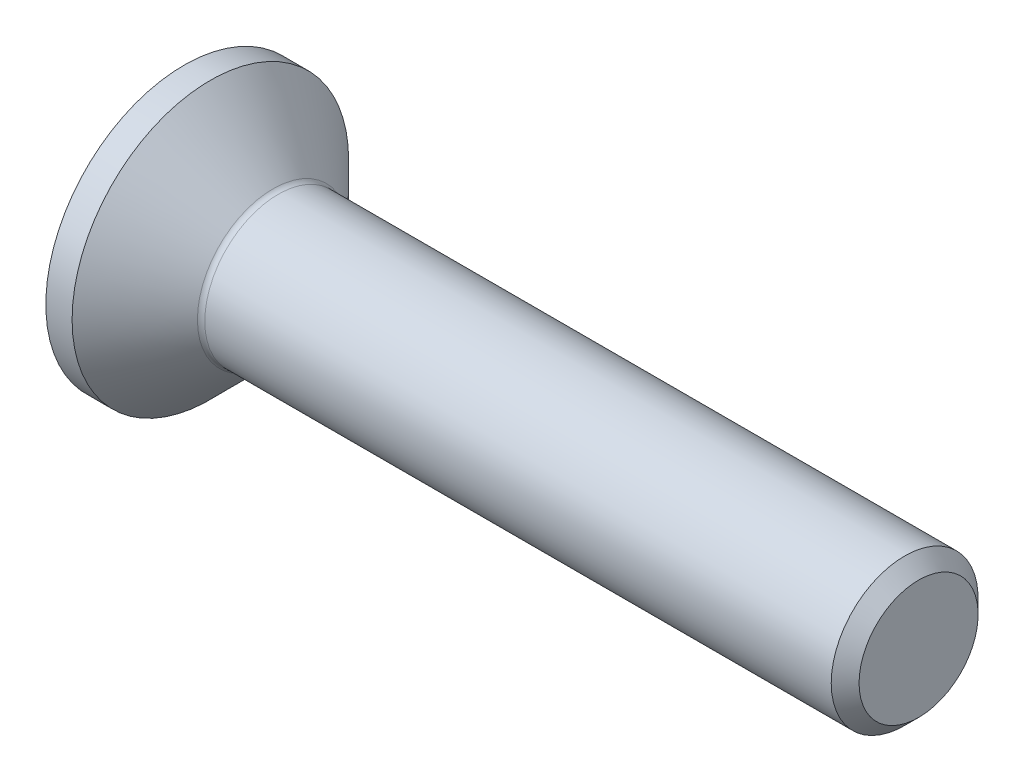
ISO-10303-21;
HEADER;
FILE_DESCRIPTION(('STEP AP214'),'2;1');
FILE_NAME('part.step','',(''),(''),'','','');
FILE_SCHEMA(('AUTOMOTIVE_DESIGN { 1 0 10303 214 1 1 1 1 }'));
ENDSEC;
DATA;
#1=APPLICATION_CONTEXT('core data for automotive mechanical design processes');
#2=APPLICATION_PROTOCOL_DEFINITION('international standard','automotive_design',2000,#1);
#3=PRODUCT_CONTEXT('',#1,'mechanical');
#4=PRODUCT('Part','Part','',(#3));
#5=PRODUCT_RELATED_PRODUCT_CATEGORY('part','',(#4));
#6=PRODUCT_DEFINITION_FORMATION('','',#4);
#7=PRODUCT_DEFINITION_CONTEXT('part definition',#1,'design');
#8=PRODUCT_DEFINITION('design','',#6,#7);
#9=PRODUCT_DEFINITION_SHAPE('','',#8);
#10=(LENGTH_UNIT() NAMED_UNIT(*) SI_UNIT(.MILLI.,.METRE.));
#11=(NAMED_UNIT(*) PLANE_ANGLE_UNIT() SI_UNIT($,.RADIAN.));
#12=(NAMED_UNIT(*) SI_UNIT($,.STERADIAN.) SOLID_ANGLE_UNIT());
#13=UNCERTAINTY_MEASURE_WITH_UNIT(LENGTH_MEASURE(1.E-05),#10,'distance_accuracy_value','');
#14=(GEOMETRIC_REPRESENTATION_CONTEXT(3) GLOBAL_UNCERTAINTY_ASSIGNED_CONTEXT((#13)) GLOBAL_UNIT_ASSIGNED_CONTEXT((#10,
#11,#12)) REPRESENTATION_CONTEXT('',''));
#15=CARTESIAN_POINT('',(0.,0.,0.));
#16=DIRECTION('',(0.,0.,1.));
#17=DIRECTION('',(1.,0.,0.));
#18=AXIS2_PLACEMENT_3D('',#15,#16,#17);
#19=CARTESIAN_POINT('',(2.48,0.,0.));
#20=DIRECTION('',(-1.,0.,0.));
#21=DIRECTION('',(0.,0.,1.));
#22=AXIS2_PLACEMENT_3D('',#19,#20,#21);
#23=CONICAL_SURFACE('',#22,1.99999999999999,0.785398163397448);
#24=CARTESIAN_POINT('',(0.714999999999991,0.,0.));
#25=DIRECTION('',(-1.,0.,0.));
#26=DIRECTION('',(0.,0.,1.));
#27=AXIS2_PLACEMENT_3D('',#24,#25,#26);
#28=CIRCLE('',#27,3.765);
#29=CARTESIAN_POINT('',(0.714999999999991,0.,3.765));
#30=VERTEX_POINT('',#29);
#31=EDGE_CURVE('E40',#30,#30,#28,.F.);
#32=ORIENTED_EDGE('',*,*,#31,.T.);
#33=EDGE_LOOP('',(#32));
#34=FACE_BOUND('',#33,.T.);
#35=CARTESIAN_POINT('',(2.42142135623731,0.,0.));
#36=DIRECTION('',(-1.,0.,0.));
#37=DIRECTION('',(0.,0.,1.));
#38=AXIS2_PLACEMENT_3D('',#35,#36,#37);
#39=CIRCLE('',#38,2.05857864376269);
#40=CARTESIAN_POINT('',(2.42142135623731,0.,2.05857864376269));
#41=VERTEX_POINT('',#40);
#42=EDGE_CURVE('E159',#41,#41,#39,.T.);
#43=ORIENTED_EDGE('',*,*,#42,.T.);
#44=EDGE_LOOP('',(#43));
#45=FACE_BOUND('',#44,.T.);
#46=ADVANCED_FACE('F36',(#34,#45),#23,.T.);
#47=CARTESIAN_POINT('',(-0.587069180985524,0.,0.));
#48=DIRECTION('',(-1.,0.,0.));
#49=DIRECTION('',(0.,0.,1.));
#50=AXIS2_PLACEMENT_3D('',#47,#48,#49);
#51=CYLINDRICAL_SURFACE('',#50,2.);
#52=CARTESIAN_POINT('',(19.621,0.,0.));
#53=DIRECTION('',(-1.,0.,0.));
#54=DIRECTION('',(0.,0.,1.));
#55=AXIS2_PLACEMENT_3D('',#52,#53,#54);
#56=CIRCLE('',#55,2.);
#57=CARTESIAN_POINT('',(19.621,0.,2.));
#58=VERTEX_POINT('',#57);
#59=EDGE_CURVE('E45',#58,#58,#56,.T.);
#60=ORIENTED_EDGE('',*,*,#59,.T.);
#61=EDGE_LOOP('',(#60));
#62=FACE_BOUND('',#61,.T.);
#63=CARTESIAN_POINT('',(2.56284271247462,0.,0.));
#64=DIRECTION('',(-1.,0.,0.));
#65=DIRECTION('',(0.,0.,1.));
#66=AXIS2_PLACEMENT_3D('',#63,#64,#65);
#67=CIRCLE('',#66,2.);
#68=CARTESIAN_POINT('',(2.56284271247462,0.,2.));
#69=VERTEX_POINT('',#68);
#70=EDGE_CURVE('E156',#69,#69,#67,.F.);
#71=ORIENTED_EDGE('',*,*,#70,.T.);
#72=EDGE_LOOP('',(#71));
#73=FACE_BOUND('',#72,.T.);
#74=ADVANCED_FACE('F127',(#62,#73),#51,.T.);
#75=CARTESIAN_POINT('',(20.,2.,0.));
#76=DIRECTION('',(-1.,0.,0.));
#77=DIRECTION('',(0.,0.,1.));
#78=AXIS2_PLACEMENT_3D('',#75,#76,#77);
#79=PLANE('',#78);
#80=CARTESIAN_POINT('',(20.,0.,0.));
#81=DIRECTION('',(-1.,0.,0.));
#82=DIRECTION('',(0.,0.,1.));
#83=AXIS2_PLACEMENT_3D('',#80,#81,#82);
#84=CIRCLE('',#83,1.62099999999999);
#85=CARTESIAN_POINT('',(20.,0.,1.62099999999999));
#86=VERTEX_POINT('',#85);
#87=EDGE_CURVE('E11',#86,#86,#84,.F.);
#88=ORIENTED_EDGE('',*,*,#87,.T.);
#89=EDGE_LOOP('',(#88));
#90=FACE_BOUND('',#89,.T.);
#91=ADVANCED_FACE('F133',(#90),#79,.F.);
#92=CARTESIAN_POINT('',(2.56284271247462,0.,0.));
#93=DIRECTION('',(-1.,0.,0.));
#94=DIRECTION('',(0.,0.,1.));
#95=AXIS2_PLACEMENT_3D('',#92,#93,#94);
#96=TOROIDAL_SURFACE('',#95,2.2,0.2);
#97=ORIENTED_EDGE('',*,*,#70,.F.);
#98=EDGE_LOOP('',(#97));
#99=FACE_BOUND('',#98,.T.);
#100=ORIENTED_EDGE('',*,*,#42,.F.);
#101=EDGE_LOOP('',(#100));
#102=FACE_BOUND('',#101,.T.);
#103=ADVANCED_FACE('F144',(#99,#102),#96,.F.);
#104=CARTESIAN_POINT('',(19.621,0.,0.));
#105=DIRECTION('',(-1.,0.,0.));
#106=DIRECTION('',(0.,0.,1.));
#107=AXIS2_PLACEMENT_3D('',#104,#105,#106);
#108=CONICAL_SURFACE('',#107,2.,0.785398163397453);
#109=ORIENTED_EDGE('',*,*,#87,.F.);
#110=EDGE_LOOP('',(#109));
#111=FACE_BOUND('',#110,.T.);
#112=ORIENTED_EDGE('',*,*,#59,.F.);
#113=EDGE_LOOP('',(#112));
#114=FACE_BOUND('',#113,.T.);
#115=ADVANCED_FACE('F38',(#111,#114),#108,.T.);
#116=CARTESIAN_POINT('',(11.8531386861314,0.,0.));
#117=DIRECTION('',(1.,0.,0.));
#118=DIRECTION('',(0.,0.,-1.));
#119=AXIS2_PLACEMENT_3D('',#116,#117,#118);
#120=CYLINDRICAL_SURFACE('',#119,3.765);
#121=ORIENTED_EDGE('',*,*,#31,.F.);
#122=EDGE_LOOP('',(#121));
#123=FACE_BOUND('',#122,.T.);
#124=CARTESIAN_POINT('',(0.,0.,0.));
#125=DIRECTION('',(1.,0.,0.));
#126=DIRECTION('',(0.,0.,-1.));
#127=AXIS2_PLACEMENT_3D('',#124,#125,#126);
#128=CIRCLE('',#127,3.765);
#129=CARTESIAN_POINT('',(0.,0.,-3.765));
#130=VERTEX_POINT('',#129);
#131=EDGE_CURVE('E225',#130,#130,#128,.F.);
#132=ORIENTED_EDGE('',*,*,#131,.F.);
#133=EDGE_LOOP('',(#132));
#134=FACE_BOUND('',#133,.T.);
#135=ADVANCED_FACE('F114',(#123,#134),#120,.T.);
#136=CARTESIAN_POINT('',(2.22168783648703,0.,0.));
#137=DIRECTION('',(-1.,0.,0.));
#138=DIRECTION('',(0.,0.,1.));
#139=AXIS2_PLACEMENT_3D('',#136,#137,#138);
#140=CONICAL_SURFACE('',#139,0.,1.0471975511966);
#141=CARTESIAN_POINT('',(1.5,0.,0.));
#142=DIRECTION('',(-1.,0.,0.));
#143=DIRECTION('',(0.,0.,1.));
#144=AXIS2_PLACEMENT_3D('',#141,#142,#143);
#145=CIRCLE('',#144,1.25);
#146=CARTESIAN_POINT('',(1.5,0.625,1.08253175473055));
#147=VERTEX_POINT('',#146);
#148=CARTESIAN_POINT('',(1.5,1.25,0.));
#149=VERTEX_POINT('',#148);
#150=EDGE_CURVE('E165',#147,#149,#145,.T.);
#151=ORIENTED_EDGE('',*,*,#150,.T.);
#152=CARTESIAN_POINT('',(1.5,0.625,-1.08253175473055));
#153=VERTEX_POINT('',#152);
#154=EDGE_CURVE('E160',#149,#153,#145,.T.);
#155=ORIENTED_EDGE('',*,*,#154,.T.);
#156=CARTESIAN_POINT('',(1.5,-0.625,-1.08253175473055));
#157=VERTEX_POINT('',#156);
#158=EDGE_CURVE('E163',#153,#157,#145,.T.);
#159=ORIENTED_EDGE('',*,*,#158,.T.);
#160=CARTESIAN_POINT('',(1.5,-1.25,0.));
#161=VERTEX_POINT('',#160);
#162=EDGE_CURVE('E244',#157,#161,#145,.T.);
#163=ORIENTED_EDGE('',*,*,#162,.T.);
#164=CARTESIAN_POINT('',(1.5,-0.625,1.08253175473055));
#165=VERTEX_POINT('',#164);
#166=EDGE_CURVE('E52',#161,#165,#145,.T.);
#167=ORIENTED_EDGE('',*,*,#166,.T.);
#168=EDGE_CURVE('E174',#165,#147,#145,.T.);
#169=ORIENTED_EDGE('',*,*,#168,.T.);
#170=EDGE_LOOP('',(#151,#155,#159,#163,#167,#169));
#171=FACE_BOUND('',#170,.T.);
#172=CARTESIAN_POINT('',(2.22168783648703,0.,0.));
#173=VERTEX_POINT('',#172);
#174=VERTEX_LOOP('',#173);
#175=FACE_BOUND('',#174,.T.);
#176=ADVANCED_FACE('F111',(#171,#175),#140,.F.);
#177=CARTESIAN_POINT('',(1.5,1.25,-2.1650635094611));
#178=DIRECTION('',(1.,0.,0.));
#179=DIRECTION('',(0.,0.,-1.));
#180=AXIS2_PLACEMENT_3D('',#177,#178,#179);
#181=PLANE('',#180);
#182=ORIENTED_EDGE('',*,*,#166,.F.);
#183=DIRECTION('',(0.,0.,-1.));
#184=VECTOR('',#183,1.);
#185=CARTESIAN_POINT('',(1.5,-1.25,0.721687836487032));
#186=LINE('',#185,#184);
#187=CARTESIAN_POINT('',(1.5,-1.25,0.721687836487032));
#188=VERTEX_POINT('',#187);
#189=EDGE_CURVE('E185',#188,#161,#186,.T.);
#190=ORIENTED_EDGE('',*,*,#189,.F.);
#191=DIRECTION('',(0.,-0.866025403784438,-0.5));
#192=VECTOR('',#191,1.);
#193=CARTESIAN_POINT('',(1.5,0.,1.44337567297406));
#194=LINE('',#193,#192);
#195=EDGE_CURVE('E209',#165,#188,#194,.T.);
#196=ORIENTED_EDGE('',*,*,#195,.F.);
#197=EDGE_LOOP('',(#182,#190,#196));
#198=FACE_BOUND('',#197,.T.);
#199=ADVANCED_FACE('F113',(#198),#181,.F.);
#200=ORIENTED_EDGE('',*,*,#168,.F.);
#201=CARTESIAN_POINT('',(1.5,0.,1.44337567297406));
#202=VERTEX_POINT('',#201);
#203=EDGE_CURVE('E206',#202,#165,#194,.T.);
#204=ORIENTED_EDGE('',*,*,#203,.F.);
#205=DIRECTION('',(0.,-0.866025403784439,0.5));
#206=VECTOR('',#205,1.);
#207=CARTESIAN_POINT('',(1.5,1.25,0.721687836487032));
#208=LINE('',#207,#206);
#209=EDGE_CURVE('E213',#147,#202,#208,.T.);
#210=ORIENTED_EDGE('',*,*,#209,.F.);
#211=EDGE_LOOP('',(#200,#204,#210));
#212=FACE_BOUND('',#211,.T.);
#213=ADVANCED_FACE('F120',(#212),#181,.F.);
#214=ORIENTED_EDGE('',*,*,#150,.F.);
#215=CARTESIAN_POINT('',(1.5,1.25,0.721687836487032));
#216=VERTEX_POINT('',#215);
#217=EDGE_CURVE('E210',#216,#147,#208,.T.);
#218=ORIENTED_EDGE('',*,*,#217,.F.);
#219=DIRECTION('',(0.,0.,1.));
#220=VECTOR('',#219,1.);
#221=CARTESIAN_POINT('',(1.5,1.25,-0.721687836487031));
#222=LINE('',#221,#220);
#223=EDGE_CURVE('E217',#149,#216,#222,.T.);
#224=ORIENTED_EDGE('',*,*,#223,.F.);
#225=EDGE_LOOP('',(#214,#218,#224));
#226=FACE_BOUND('',#225,.T.);
#227=ADVANCED_FACE('F275',(#226),#181,.F.);
#228=ORIENTED_EDGE('',*,*,#154,.F.);
#229=CARTESIAN_POINT('',(1.5,1.25,-0.721687836487031));
#230=VERTEX_POINT('',#229);
#231=EDGE_CURVE('E214',#230,#149,#222,.T.);
#232=ORIENTED_EDGE('',*,*,#231,.F.);
#233=DIRECTION('',(0.,0.866025403784438,0.5));
#234=VECTOR('',#233,1.);
#235=CARTESIAN_POINT('',(1.5,0.,-1.44337567297406));
#236=LINE('',#235,#234);
#237=EDGE_CURVE('E221',#153,#230,#236,.T.);
#238=ORIENTED_EDGE('',*,*,#237,.F.);
#239=EDGE_LOOP('',(#228,#232,#238));
#240=FACE_BOUND('',#239,.T.);
#241=ADVANCED_FACE('F280',(#240),#181,.F.);
#242=ORIENTED_EDGE('',*,*,#158,.F.);
#243=CARTESIAN_POINT('',(1.5,0.,-1.44337567297406));
#244=VERTEX_POINT('',#243);
#245=EDGE_CURVE('E218',#244,#153,#236,.T.);
#246=ORIENTED_EDGE('',*,*,#245,.F.);
#247=DIRECTION('',(0.,0.866025403784439,-0.5));
#248=VECTOR('',#247,1.);
#249=CARTESIAN_POINT('',(1.5,-1.25,-0.721687836487033));
#250=LINE('',#249,#248);
#251=EDGE_CURVE('E189',#157,#244,#250,.T.);
#252=ORIENTED_EDGE('',*,*,#251,.F.);
#253=EDGE_LOOP('',(#242,#246,#252));
#254=FACE_BOUND('',#253,.T.);
#255=ADVANCED_FACE('F249',(#254),#181,.F.);
#256=ORIENTED_EDGE('',*,*,#162,.F.);
#257=CARTESIAN_POINT('',(1.5,-1.25,-0.721687836487033));
#258=VERTEX_POINT('',#257);
#259=EDGE_CURVE('E222',#258,#157,#250,.T.);
#260=ORIENTED_EDGE('',*,*,#259,.F.);
#261=EDGE_CURVE('E205',#161,#258,#186,.T.);
#262=ORIENTED_EDGE('',*,*,#261,.F.);
#263=EDGE_LOOP('',(#256,#260,#262));
#264=FACE_BOUND('',#263,.T.);
#265=ADVANCED_FACE('F123',(#264),#181,.F.);
#266=CARTESIAN_POINT('',(1.5,-1.25,0.721687836487032));
#267=DIRECTION('',(0.,1.,0.));
#268=DIRECTION('',(0.,0.,1.));
#269=AXIS2_PLACEMENT_3D('',#266,#267,#268);
#270=PLANE('',#269);
#271=DIRECTION('',(0.,0.,-1.));
#272=VECTOR('',#271,1.);
#273=CARTESIAN_POINT('',(0.,-1.25,0.721687836487032));
#274=LINE('',#273,#272);
#275=CARTESIAN_POINT('',(0.,-1.25,0.721687836487032));
#276=VERTEX_POINT('',#275);
#277=CARTESIAN_POINT('',(0.,-1.25,-0.721687836487033));
#278=VERTEX_POINT('',#277);
#279=EDGE_CURVE('E186',#276,#278,#274,.T.);
#280=ORIENTED_EDGE('',*,*,#279,.F.);
#281=DIRECTION('',(-1.,0.,0.));
#282=VECTOR('',#281,1.);
#283=CARTESIAN_POINT('',(1.5,-1.25,0.721687836487032));
#284=LINE('',#283,#282);
#285=EDGE_CURVE('E181',#188,#276,#284,.T.);
#286=ORIENTED_EDGE('',*,*,#285,.F.);
#287=ORIENTED_EDGE('',*,*,#189,.T.);
#288=ORIENTED_EDGE('',*,*,#261,.T.);
#289=DIRECTION('',(-1.,0.,0.));
#290=VECTOR('',#289,1.);
#291=CARTESIAN_POINT('',(1.5,-1.25,-0.721687836487033));
#292=LINE('',#291,#290);
#293=EDGE_CURVE('E183',#258,#278,#292,.T.);
#294=ORIENTED_EDGE('',*,*,#293,.T.);
#295=EDGE_LOOP('',(#280,#286,#287,#288,#294));
#296=FACE_BOUND('',#295,.T.);
#297=ADVANCED_FACE('F238',(#296),#270,.T.);
#298=CARTESIAN_POINT('',(1.5,0.,1.44337567297406));
#299=DIRECTION('',(0.,0.5,-0.866025403784439));
#300=DIRECTION('',(0.,0.866025403784439,0.5));
#301=AXIS2_PLACEMENT_3D('',#298,#299,#300);
#302=PLANE('',#301);
#303=DIRECTION('',(0.,-0.866025403784438,-0.5));
#304=VECTOR('',#303,1.);
#305=CARTESIAN_POINT('',(0.,0.,1.44337567297406));
#306=LINE('',#305,#304);
#307=CARTESIAN_POINT('',(0.,0.,1.44337567297406));
#308=VERTEX_POINT('',#307);
#309=EDGE_CURVE('E190',#308,#276,#306,.T.);
#310=ORIENTED_EDGE('',*,*,#309,.F.);
#311=DIRECTION('',(-1.,0.,0.));
#312=VECTOR('',#311,1.);
#313=CARTESIAN_POINT('',(1.5,0.,1.44337567297406));
#314=LINE('',#313,#312);
#315=EDGE_CURVE('E179',#202,#308,#314,.T.);
#316=ORIENTED_EDGE('',*,*,#315,.F.);
#317=ORIENTED_EDGE('',*,*,#203,.T.);
#318=ORIENTED_EDGE('',*,*,#195,.T.);
#319=ORIENTED_EDGE('',*,*,#285,.T.);
#320=EDGE_LOOP('',(#310,#316,#317,#318,#319));
#321=FACE_BOUND('',#320,.T.);
#322=ADVANCED_FACE('F268',(#321),#302,.T.);
#323=CARTESIAN_POINT('',(1.5,1.25,0.721687836487032));
#324=DIRECTION('',(0.,-0.5,-0.866025403784439));
#325=DIRECTION('',(0.,0.866025403784439,-0.5));
#326=AXIS2_PLACEMENT_3D('',#323,#324,#325);
#327=PLANE('',#326);
#328=DIRECTION('',(0.,-0.866025403784439,0.5));
#329=VECTOR('',#328,1.);
#330=CARTESIAN_POINT('',(0.,1.25,0.721687836487032));
#331=LINE('',#330,#329);
#332=CARTESIAN_POINT('',(0.,1.25,0.721687836487032));
#333=VERTEX_POINT('',#332);
#334=EDGE_CURVE('E193',#333,#308,#331,.T.);
#335=ORIENTED_EDGE('',*,*,#334,.F.);
#336=DIRECTION('',(-1.,0.,0.));
#337=VECTOR('',#336,1.);
#338=CARTESIAN_POINT('',(1.5,1.25,0.721687836487032));
#339=LINE('',#338,#337);
#340=EDGE_CURVE('E177',#216,#333,#339,.T.);
#341=ORIENTED_EDGE('',*,*,#340,.F.);
#342=ORIENTED_EDGE('',*,*,#217,.T.);
#343=ORIENTED_EDGE('',*,*,#209,.T.);
#344=ORIENTED_EDGE('',*,*,#315,.T.);
#345=EDGE_LOOP('',(#335,#341,#342,#343,#344));
#346=FACE_BOUND('',#345,.T.);
#347=ADVANCED_FACE('F262',(#346),#327,.T.);
#348=CARTESIAN_POINT('',(1.5,1.25,-0.721687836487031));
#349=DIRECTION('',(0.,-1.,0.));
#350=DIRECTION('',(0.,0.,-1.));
#351=AXIS2_PLACEMENT_3D('',#348,#349,#350);
#352=PLANE('',#351);
#353=DIRECTION('',(0.,0.,1.));
#354=VECTOR('',#353,1.);
#355=CARTESIAN_POINT('',(0.,1.25,-0.721687836487031));
#356=LINE('',#355,#354);
#357=CARTESIAN_POINT('',(0.,1.25,-0.721687836487031));
#358=VERTEX_POINT('',#357);
#359=EDGE_CURVE('E196',#358,#333,#356,.T.);
#360=ORIENTED_EDGE('',*,*,#359,.F.);
#361=DIRECTION('',(-1.,0.,0.));
#362=VECTOR('',#361,1.);
#363=CARTESIAN_POINT('',(1.5,1.25,-0.721687836487031));
#364=LINE('',#363,#362);
#365=EDGE_CURVE('E175',#230,#358,#364,.T.);
#366=ORIENTED_EDGE('',*,*,#365,.F.);
#367=ORIENTED_EDGE('',*,*,#231,.T.);
#368=ORIENTED_EDGE('',*,*,#223,.T.);
#369=ORIENTED_EDGE('',*,*,#340,.T.);
#370=EDGE_LOOP('',(#360,#366,#367,#368,#369));
#371=FACE_BOUND('',#370,.T.);
#372=ADVANCED_FACE('F258',(#371),#352,.T.);
#373=CARTESIAN_POINT('',(1.5,0.,-1.44337567297406));
#374=DIRECTION('',(0.,-0.5,0.866025403784439));
#375=DIRECTION('',(0.,-0.866025403784439,-0.5));
#376=AXIS2_PLACEMENT_3D('',#373,#374,#375);
#377=PLANE('',#376);
#378=DIRECTION('',(0.,0.866025403784438,0.5));
#379=VECTOR('',#378,1.);
#380=CARTESIAN_POINT('',(0.,0.,-1.44337567297406));
#381=LINE('',#380,#379);
#382=CARTESIAN_POINT('',(0.,0.,-1.44337567297406));
#383=VERTEX_POINT('',#382);
#384=EDGE_CURVE('E199',#383,#358,#381,.T.);
#385=ORIENTED_EDGE('',*,*,#384,.F.);
#386=DIRECTION('',(-1.,0.,0.));
#387=VECTOR('',#386,1.);
#388=CARTESIAN_POINT('',(1.5,0.,-1.44337567297406));
#389=LINE('',#388,#387);
#390=EDGE_CURVE('E167',#244,#383,#389,.T.);
#391=ORIENTED_EDGE('',*,*,#390,.F.);
#392=ORIENTED_EDGE('',*,*,#245,.T.);
#393=ORIENTED_EDGE('',*,*,#237,.T.);
#394=ORIENTED_EDGE('',*,*,#365,.T.);
#395=EDGE_LOOP('',(#385,#391,#392,#393,#394));
#396=FACE_BOUND('',#395,.T.);
#397=ADVANCED_FACE('F253',(#396),#377,.T.);
#398=CARTESIAN_POINT('',(1.5,-1.25,-0.721687836487033));
#399=DIRECTION('',(0.,0.5,0.866025403784439));
#400=DIRECTION('',(0.,-0.866025403784439,0.5));
#401=AXIS2_PLACEMENT_3D('',#398,#399,#400);
#402=PLANE('',#401);
#403=DIRECTION('',(0.,0.866025403784439,-0.5));
#404=VECTOR('',#403,1.);
#405=CARTESIAN_POINT('',(0.,-1.25,-0.721687836487033));
#406=LINE('',#405,#404);
#407=EDGE_CURVE('E60',#278,#383,#406,.T.);
#408=ORIENTED_EDGE('',*,*,#407,.F.);
#409=ORIENTED_EDGE('',*,*,#293,.F.);
#410=ORIENTED_EDGE('',*,*,#259,.T.);
#411=ORIENTED_EDGE('',*,*,#251,.T.);
#412=ORIENTED_EDGE('',*,*,#390,.T.);
#413=EDGE_LOOP('',(#408,#409,#410,#411,#412));
#414=FACE_BOUND('',#413,.T.);
#415=ADVANCED_FACE('F142',(#414),#402,.T.);
#416=CARTESIAN_POINT('',(0.,0.,0.));
#417=DIRECTION('',(1.,0.,0.));
#418=DIRECTION('',(0.,0.,-1.));
#419=AXIS2_PLACEMENT_3D('',#416,#417,#418);
#420=PLANE('',#419);
#421=ORIENTED_EDGE('',*,*,#131,.T.);
#422=EDGE_LOOP('',(#421));
#423=FACE_BOUND('',#422,.T.);
#424=ORIENTED_EDGE('',*,*,#407,.T.);
#425=ORIENTED_EDGE('',*,*,#384,.T.);
#426=ORIENTED_EDGE('',*,*,#359,.T.);
#427=ORIENTED_EDGE('',*,*,#334,.T.);
#428=ORIENTED_EDGE('',*,*,#309,.T.);
#429=ORIENTED_EDGE('',*,*,#279,.T.);
#430=EDGE_LOOP('',(#424,#425,#426,#427,#428,#429));
#431=FACE_BOUND('',#430,.T.);
#432=ADVANCED_FACE('F140',(#423,#431),#420,.F.);
#433=CLOSED_SHELL('',(#46,#74,#91,#103,#115,#135,#176,#199,#213,#227,#241,#255,#265,#297,#322,
#347,#372,#397,#415,#432));
#434=MANIFOLD_SOLID_BREP('B2',#433);
#435=ADVANCED_BREP_SHAPE_REPRESENTATION('',(#18,#434),#14);
#436=SHAPE_DEFINITION_REPRESENTATION(#9,#435);
ENDSEC;
END-ISO-10303-21;
